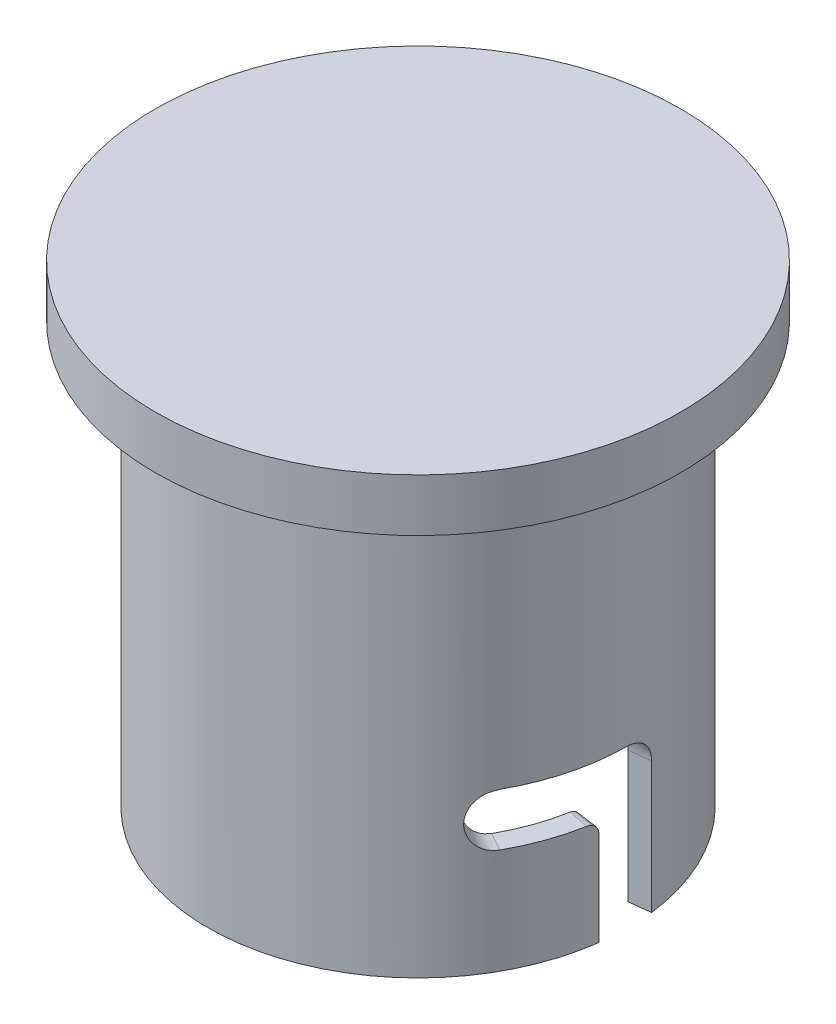
ISO-10303-21;
HEADER;
FILE_DESCRIPTION(('STEP AP214'),'2;1');
FILE_NAME('part.step','',(''),(''),'','','');
FILE_SCHEMA(('AUTOMOTIVE_DESIGN { 1 0 10303 214 1 1 1 1 }'));
ENDSEC;
DATA;
#1=APPLICATION_CONTEXT('core data for automotive mechanical design processes');
#2=APPLICATION_PROTOCOL_DEFINITION('international standard','automotive_design',2000,#1);
#3=PRODUCT_CONTEXT('',#1,'mechanical');
#4=PRODUCT('Part','Part','',(#3));
#5=PRODUCT_RELATED_PRODUCT_CATEGORY('part','',(#4));
#6=PRODUCT_DEFINITION_FORMATION('','',#4);
#7=PRODUCT_DEFINITION_CONTEXT('part definition',#1,'design');
#8=PRODUCT_DEFINITION('design','',#6,#7);
#9=PRODUCT_DEFINITION_SHAPE('','',#8);
#10=(LENGTH_UNIT() NAMED_UNIT(*) SI_UNIT(.MILLI.,.METRE.));
#11=(NAMED_UNIT(*) PLANE_ANGLE_UNIT() SI_UNIT($,.RADIAN.));
#12=(NAMED_UNIT(*) SI_UNIT($,.STERADIAN.) SOLID_ANGLE_UNIT());
#13=UNCERTAINTY_MEASURE_WITH_UNIT(LENGTH_MEASURE(1.E-05),#10,'distance_accuracy_value','');
#14=(GEOMETRIC_REPRESENTATION_CONTEXT(3) GLOBAL_UNCERTAINTY_ASSIGNED_CONTEXT((#13)) GLOBAL_UNIT_ASSIGNED_CONTEXT((#10,
#11,#12)) REPRESENTATION_CONTEXT('',''));
#15=CARTESIAN_POINT('',(0.,0.,0.));
#16=DIRECTION('',(0.,0.,1.));
#17=DIRECTION('',(1.,0.,0.));
#18=AXIS2_PLACEMENT_3D('',#15,#16,#17);
#19=CARTESIAN_POINT('',(0.,40.,0.));
#20=DIRECTION('',(0.,-1.,0.));
#21=DIRECTION('',(0.,0.,-1.));
#22=AXIS2_PLACEMENT_3D('',#19,#20,#21);
#23=CYLINDRICAL_SURFACE('',#22,20.);
#24=CARTESIAN_POINT('',(0.,40.,0.));
#25=DIRECTION('',(0.,1.,0.));
#26=DIRECTION('',(0.,0.,1.));
#27=AXIS2_PLACEMENT_3D('',#24,#25,#26);
#28=CIRCLE('',#27,20.);
#29=CARTESIAN_POINT('',(0.,40.,20.));
#30=VERTEX_POINT('',#29);
#31=EDGE_CURVE('E436',#30,#30,#28,.T.);
#32=ORIENTED_EDGE('',*,*,#31,.F.);
#33=EDGE_LOOP('',(#32));
#34=FACE_BOUND('',#33,.T.);
#35=CARTESIAN_POINT('',(19.8589094074725,12.5,-2.37143778029271));
#36=CARTESIAN_POINT('',(19.8589547040477,12.8308364793802,-2.37105845742376));
#37=CARTESIAN_POINT('',(19.8668685881039,13.153453684531,-2.3072297599529));
#38=CARTESIAN_POINT('',(19.8942803443769,13.7599634714098,-2.05751943892231));
#39=CARTESIAN_POINT('',(19.9133382604535,14.0356629825237,-1.87425378914839));
#40=CARTESIAN_POINT('',(19.9514701062574,14.4998709159118,-1.41163328825012));
#41=CARTESIAN_POINT('',(19.9698885128278,14.6831063583117,-1.13883562178624));
#42=CARTESIAN_POINT('',(19.9953605168616,14.936291301485,-0.528158677817419));
#43=CARTESIAN_POINT('',(20.0016645245603,14.9997250202019,-0.209231886669876));
#44=CARTESIAN_POINT('',(19.9996219608105,15.,0.122969202112117));
#45=B_SPLINE_CURVE_WITH_KNOTS('',3,(#35,#36,#37,#38,#39,#40,#41,#42,#43,#44),.UNSPECIFIED.,.F.,
.F.,(4,2,2,2,4),(0.,0.25,0.5,0.75,1.),.UNSPECIFIED.);
#46=CARTESIAN_POINT('',(19.8589094074725,12.5,-2.37143778029269));
#47=VERTEX_POINT('',#46);
#48=CARTESIAN_POINT('',(19.9996219608105,15.,0.122969202112117));
#49=VERTEX_POINT('',#48);
#50=EDGE_CURVE('E228',#47,#49,#45,.T.);
#51=ORIENTED_EDGE('',*,*,#50,.F.);
#52=DIRECTION('',(0.,1.,0.));
#53=VECTOR('',#52,1.);
#54=CARTESIAN_POINT('',(19.8589094074725,0.,-2.37143778029269));
#55=LINE('',#54,#53);
#56=CARTESIAN_POINT('',(19.8589094074725,0.,-2.3714377802927));
#57=VERTEX_POINT('',#56);
#58=EDGE_CURVE('E222',#57,#47,#55,.T.);
#59=ORIENTED_EDGE('',*,*,#58,.F.);
#60=CARTESIAN_POINT('',(0.,0.,0.));
#61=DIRECTION('',(0.,1.,0.));
#62=DIRECTION('',(0.,0.,1.));
#63=AXIS2_PLACEMENT_3D('',#60,#61,#62);
#64=CIRCLE('',#63,20.);
#65=CARTESIAN_POINT('',(19.8282471024967,0.,2.61545729124608));
#66=VERTEX_POINT('',#65);
#67=EDGE_CURVE('E220',#57,#66,#64,.T.);
#68=ORIENTED_EDGE('',*,*,#67,.T.);
#69=DIRECTION('',(0.,-1.,0.));
#70=VECTOR('',#69,1.);
#71=CARTESIAN_POINT('',(19.8282471024967,8.99999999999999,2.61545729124608));
#72=LINE('',#71,#70);
#73=CARTESIAN_POINT('',(19.8282471024967,8.99999999999999,2.61545729124608));
#74=VERTEX_POINT('',#73);
#75=EDGE_CURVE('E194',#74,#66,#72,.T.);
#76=ORIENTED_EDGE('',*,*,#75,.F.);
#77=CARTESIAN_POINT('',(19.6727485741149,10.,3.60318796896047));
#78=CARTESIAN_POINT('',(19.7205673300936,9.999233775285,3.34210629029147));
#79=CARTESIAN_POINT('',(19.7605805048956,9.89458663830739,3.09105383929096));
#80=CARTESIAN_POINT('',(19.815059057951,9.51962691803397,2.72003497362964));
#81=CARTESIAN_POINT('',(19.8282306451258,9.26463589901939,2.61558205750306));
#82=CARTESIAN_POINT('',(19.8282471024967,9.,2.61545729124608));
#83=B_SPLINE_CURVE_WITH_KNOTS('',3,(#77,#78,#79,#80,#81,#82),.UNSPECIFIED.,.F.,.F.,(4,2,4),(0.,
0.5,1.),.UNSPECIFIED.);
#84=CARTESIAN_POINT('',(19.6727485741149,10.,3.60318796896043));
#85=VERTEX_POINT('',#84);
#86=EDGE_CURVE('E204',#85,#74,#83,.T.);
#87=ORIENTED_EDGE('',*,*,#86,.F.);
#88=CARTESIAN_POINT('',(0.,10.,0.));
#89=DIRECTION('',(0.,-1.,0.));
#90=DIRECTION('',(0.874618245062634,0.,0.484812257893257));
#91=AXIS2_PLACEMENT_3D('',#88,#89,#90);
#92=CIRCLE('',#91,20.);
#93=CARTESIAN_POINT('',(17.4923649012527,10.,9.69624515786516));
#94=VERTEX_POINT('',#93);
#95=EDGE_CURVE('E200',#85,#94,#92,.T.);
#96=ORIENTED_EDGE('',*,*,#95,.T.);
#97=CARTESIAN_POINT('',(17.4923649012527,15.,9.69624515786516));
#98=CARTESIAN_POINT('',(17.4659026222705,14.9935666417804,9.74398403333079));
#99=CARTESIAN_POINT('',(17.4425764725378,14.9878406187517,9.78561162600905));
#100=CARTESIAN_POINT('',(17.412485215332,14.9803125547096,9.83899262372414));
#101=CARTESIAN_POINT('',(17.4032705361512,14.9779800302394,9.85527591818541));
#102=CARTESIAN_POINT('',(17.3906910485126,14.9747464888497,9.87744587682938));
#103=CARTESIAN_POINT('',(17.3867049377865,14.9737128492724,9.88446001329253));
#104=CARTESIAN_POINT('',(17.3791495345321,14.9717339852231,9.89773811556978));
#105=CARTESIAN_POINT('',(17.3778243673571,14.9713906037298,9.90006808876281));
#106=CARTESIAN_POINT('',(17.3498053809616,14.963876304239,9.94918588228946));
#107=CARTESIAN_POINT('',(17.328439976691,14.9577713536587,9.98633092393268));
#108=CARTESIAN_POINT('',(17.2980270682451,14.9484736613065,10.0388579471611));
#109=CARTESIAN_POINT('',(17.2881618909834,14.9453510527756,10.05583516671));
#110=CARTESIAN_POINT('',(17.2689856580186,14.9390590802197,10.0887311794913));
#111=CARTESIAN_POINT('',(17.2619243417968,14.9366851855727,10.1008150620805));
#112=CARTESIAN_POINT('',(17.2055272200847,14.9167441298247,10.1969497146574));
#113=CARTESIAN_POINT('',(17.1626757250958,14.8984401132341,10.2688205072563));
#114=CARTESIAN_POINT('',(17.1020693387832,14.8674573303595,10.3692214025553));
#115=CARTESIAN_POINT('',(17.0824786135493,14.85654194307,10.4014540076984));
#116=CARTESIAN_POINT('',(17.0445604228512,14.8335355824946,10.4634736607118));
#117=CARTESIAN_POINT('',(17.028040366725,14.8227409547647,10.4903390303177));
#118=CARTESIAN_POINT('',(16.9695865812886,14.7808156192456,10.5848296191978));
#119=CARTESIAN_POINT('',(16.9308068870763,14.7480697108806,10.6467349642828));
#120=CARTESIAN_POINT('',(16.8536882697519,14.672986524779,10.7683972323265));
#121=CARTESIAN_POINT('',(16.8138032272806,14.6287360036733,10.8305368153295));
#122=CARTESIAN_POINT('',(16.7041751965448,14.4930768465146,10.9994798831041));
#123=CARTESIAN_POINT('',(16.6329530521104,14.3854551131481,11.1066801565973));
#124=CARTESIAN_POINT('',(16.4379127879278,14.0325267498291,11.3951265247528));
#125=CARTESIAN_POINT('',(16.3312770907187,13.756958011426,11.5457806192111));
#126=CARTESIAN_POINT('',(16.1855131110695,13.1545869989615,11.749247927088));
#127=CARTESIAN_POINT('',(16.1470576085394,12.8263582796933,11.8013783343635));
#128=CARTESIAN_POINT('',(16.1469804649446,12.1718528857845,11.8014838841974));
#129=CARTESIAN_POINT('',(16.1861256874978,11.843076520336,11.7484014228928));
#130=CARTESIAN_POINT('',(16.3315985182214,11.2408319441748,11.5453233217843));
#131=CARTESIAN_POINT('',(16.4371318527038,10.9682975356471,11.3963106729608));
#132=CARTESIAN_POINT('',(16.700312726726,10.4959011473358,11.0070320853245));
#133=CARTESIAN_POINT('',(16.8507940608972,10.3070616306133,10.7769173509493));
#134=CARTESIAN_POINT('',(17.0493647372515,10.155975679482,10.4558530288381));
#135=CARTESIAN_POINT('',(17.0922485936947,10.1289226138573,10.3855841535286));
#136=CARTESIAN_POINT('',(17.1487209377701,10.0996008596797,10.291875448535));
#137=CARTESIAN_POINT('',(17.1682666056992,10.0904538660404,10.2592489787698));
#138=CARTESIAN_POINT('',(17.198632531122,10.0776737622114,10.2082041036913));
#139=CARTESIAN_POINT('',(17.208929045017,10.0735704587067,10.1908382699703));
#140=CARTESIAN_POINT('',(17.2298649480291,10.0656773139072,10.1554013900879));
#141=CARTESIAN_POINT('',(17.2423122648774,10.0612797148598,10.1342480810072));
#142=CARTESIAN_POINT('',(17.2693112707112,10.0522036575486,10.0882185673705));
#143=CARTESIAN_POINT('',(17.2884390896907,10.0463844861088,10.0554215557567));
#144=CARTESIAN_POINT('',(17.3187701219821,10.0380030291007,10.0030299743338));
#145=CARTESIAN_POINT('',(17.3291536103974,10.0352670934566,9.98503340212062));
#146=CARTESIAN_POINT('',(17.3451312207,10.0312500150284,9.95723541753683));
#147=CARTESIAN_POINT('',(17.3505241491294,10.0299254597253,9.9478355662533));
#148=CARTESIAN_POINT('',(17.3614428438929,10.0273052907984,9.92876745024161));
#149=CARTESIAN_POINT('',(17.3692101861179,10.0254960824757,9.91516934926903));
#150=CARTESIAN_POINT('',(17.3993597486922,10.0185881497084,9.86231240866186));
#151=CARTESIAN_POINT('',(17.4395870837337,10.0103453658396,9.79145818390802));
#152=CARTESIAN_POINT('',(17.4923649012527,10.,9.69624515786516));
#153=B_SPLINE_CURVE_WITH_KNOTS('',3,(#97,#98,#99,#100,#101,#102,#103,#104,#105,#106,#107,#108,
#109,#110,#111,#112,#113,#114,#115,#116,#117,#118,#119,#120,#121,#122,#123,#124,#125,#126,#127,
#128,#129,#130,#131,#132,#133,#134,#135,#136,#137,#138,#139,#140,#141,#142,#143,#144,#145,#146,
#147,#148,#149,#150,#151,#152),.UNSPECIFIED.,.F.,.F.,(4,2,2,2,2,2,2,2,2,2,2,2,2,2,2,2,2,2,2,2,2,
2,2,2,2,2,2,4),(0.,0.015625,0.0234375,0.02734375,0.03125,0.046875,0.0546875,0.0625,0.09375,
0.109375,0.125,0.15625,0.1875,0.25,0.375,0.5,0.625,0.75,0.875,0.90625,0.921875,0.9296875,0.9375,
0.953125,0.9609375,0.96484375,0.96875,1.),.UNSPECIFIED.);
#154=CARTESIAN_POINT('',(17.4923649012527,15.,9.69624515786514));
#155=VERTEX_POINT('',#154);
#156=EDGE_CURVE('E235',#155,#94,#153,.T.);
#157=ORIENTED_EDGE('',*,*,#156,.F.);
#158=CARTESIAN_POINT('',(0.,15.,0.));
#159=DIRECTION('',(0.,-1.,0.));
#160=DIRECTION('',(0.874618245062634,0.,0.484812257893257));
#161=AXIS2_PLACEMENT_3D('',#158,#159,#160);
#162=CIRCLE('',#161,20.);
#163=EDGE_CURVE('E241',#49,#155,#162,.T.);
#164=ORIENTED_EDGE('',*,*,#163,.F.);
#165=EDGE_LOOP('',(#51,#59,#68,#76,#87,#96,#157,#164));
#166=FACE_BOUND('',#165,.T.);
#167=ADVANCED_FACE('F124',(#34,#166),#23,.T.);
#168=CARTESIAN_POINT('',(0.,0.,0.));
#169=DIRECTION('',(0.,1.,0.));
#170=DIRECTION('',(0.,0.,1.));
#171=AXIS2_PLACEMENT_3D('',#168,#169,#170);
#172=PLANE('',#171);
#173=ORIENTED_EDGE('',*,*,#67,.F.);
#174=DIRECTION('',(0.992945470373626,0.,-0.118571889014635));
#175=VECTOR('',#174,1.);
#176=CARTESIAN_POINT('',(19.8589094074725,0.,-2.3714377802927));
#177=LINE('',#176,#175);
#178=CARTESIAN_POINT('',(17.8730184667253,0.,-2.13429400226343));
#179=VERTEX_POINT('',#178);
#180=EDGE_CURVE('E414',#179,#57,#177,.T.);
#181=ORIENTED_EDGE('',*,*,#180,.F.);
#182=CARTESIAN_POINT('',(0.,0.,0.));
#183=DIRECTION('',(0.,1.,0.));
#184=DIRECTION('',(0.,0.,1.));
#185=AXIS2_PLACEMENT_3D('',#182,#183,#184);
#186=CIRCLE('',#185,18.);
#187=CARTESIAN_POINT('',(17.845422392247,0.,2.35391156212147));
#188=VERTEX_POINT('',#187);
#189=EDGE_CURVE('E424',#179,#188,#186,.T.);
#190=ORIENTED_EDGE('',*,*,#189,.T.);
#191=DIRECTION('',(0.991412355124834,0.,0.130772864562304));
#192=VECTOR('',#191,1.);
#193=CARTESIAN_POINT('',(19.8282471024967,0.,2.61545729124608));
#194=LINE('',#193,#192);
#195=EDGE_CURVE('E142',#188,#66,#194,.T.);
#196=ORIENTED_EDGE('',*,*,#195,.T.);
#197=EDGE_LOOP('',(#173,#181,#190,#196));
#198=FACE_BOUND('',#197,.T.);
#199=ADVANCED_FACE('F503',(#198),#172,.F.);
#200=CARTESIAN_POINT('',(0.,45.,0.));
#201=DIRECTION('',(0.,-1.,0.));
#202=DIRECTION('',(0.,0.,-1.));
#203=AXIS2_PLACEMENT_3D('',#200,#201,#202);
#204=CYLINDRICAL_SURFACE('',#203,25.);
#205=CARTESIAN_POINT('',(0.,45.,0.));
#206=DIRECTION('',(0.,1.,0.));
#207=DIRECTION('',(0.,0.,1.));
#208=AXIS2_PLACEMENT_3D('',#205,#206,#207);
#209=CIRCLE('',#208,25.);
#210=CARTESIAN_POINT('',(0.,45.,25.));
#211=VERTEX_POINT('',#210);
#212=EDGE_CURVE('E430',#211,#211,#209,.T.);
#213=ORIENTED_EDGE('',*,*,#212,.F.);
#214=EDGE_LOOP('',(#213));
#215=FACE_BOUND('',#214,.T.);
#216=CARTESIAN_POINT('',(0.,40.,0.));
#217=DIRECTION('',(0.,1.,0.));
#218=DIRECTION('',(0.,0.,1.));
#219=AXIS2_PLACEMENT_3D('',#216,#217,#218);
#220=CIRCLE('',#219,25.);
#221=CARTESIAN_POINT('',(0.,40.,25.));
#222=VERTEX_POINT('',#221);
#223=EDGE_CURVE('E433',#222,#222,#220,.T.);
#224=ORIENTED_EDGE('',*,*,#223,.T.);
#225=EDGE_LOOP('',(#224));
#226=FACE_BOUND('',#225,.T.);
#227=ADVANCED_FACE('F508',(#215,#226),#204,.T.);
#228=CARTESIAN_POINT('',(0.,45.,0.));
#229=DIRECTION('',(0.,1.,0.));
#230=DIRECTION('',(0.,0.,1.));
#231=AXIS2_PLACEMENT_3D('',#228,#229,#230);
#232=PLANE('',#231);
#233=ORIENTED_EDGE('',*,*,#212,.T.);
#234=EDGE_LOOP('',(#233));
#235=FACE_BOUND('',#234,.T.);
#236=ADVANCED_FACE('F514',(#235),#232,.T.);
#237=CARTESIAN_POINT('',(0.,40.,0.));
#238=DIRECTION('',(0.,1.,0.));
#239=DIRECTION('',(0.,0.,1.));
#240=AXIS2_PLACEMENT_3D('',#237,#238,#239);
#241=PLANE('',#240);
#242=ORIENTED_EDGE('',*,*,#31,.T.);
#243=EDGE_LOOP('',(#242));
#244=FACE_BOUND('',#243,.T.);
#245=ORIENTED_EDGE('',*,*,#223,.F.);
#246=EDGE_LOOP('',(#245));
#247=FACE_BOUND('',#246,.T.);
#248=ADVANCED_FACE('F511',(#244,#247),#241,.F.);
#249=CARTESIAN_POINT('',(0.,40.,0.));
#250=DIRECTION('',(0.,-1.,0.));
#251=DIRECTION('',(0.,0.,-1.));
#252=AXIS2_PLACEMENT_3D('',#249,#250,#251);
#253=CYLINDRICAL_SURFACE('',#252,18.);
#254=DIRECTION('',(0.,-1.,0.));
#255=VECTOR('',#254,1.);
#256=CARTESIAN_POINT('',(17.8730184667253,40.,-2.13429400226343));
#257=LINE('',#256,#255);
#258=CARTESIAN_POINT('',(17.8730184667253,12.5,-2.13429400226343));
#259=VERTEX_POINT('',#258);
#260=EDGE_CURVE('E98',#259,#179,#257,.T.);
#261=ORIENTED_EDGE('',*,*,#260,.F.);
#262=CARTESIAN_POINT('',(17.9996597647294,15.,0.110672281900905));
#263=CARTESIAN_POINT('',(18.0000183681805,14.9999715038201,0.0528302615950338));
#264=CARTESIAN_POINT('',(18.0000923905676,14.9975306223466,-0.00502097003931292));
#265=CARTESIAN_POINT('',(17.9996895136451,14.9877736966905,-0.120290114524648));
#266=CARTESIAN_POINT('',(17.9992127803985,14.9804591222964,-0.177708152738345));
#267=CARTESIAN_POINT('',(17.9977292689165,14.9609366001135,-0.291507236592393));
#268=CARTESIAN_POINT('',(17.9967242380058,14.9487448150928,-0.3478910703576));
#269=CARTESIAN_POINT('',(17.9942229502004,14.9195966749715,-0.459401007314599));
#270=CARTESIAN_POINT('',(17.9927266783966,14.9026401752636,-0.514527072278656));
#271=CARTESIAN_POINT('',(17.9892931387922,14.8642313739118,-0.62312396124298));
#272=CARTESIAN_POINT('',(17.9873561963751,14.8427823903633,-0.676595973638972));
#273=CARTESIAN_POINT('',(17.9830970027641,14.7957154766263,-0.781655257539518));
#274=CARTESIAN_POINT('',(17.9807747391382,14.7700974119285,-0.833242468167917));
#275=CARTESIAN_POINT('',(17.9758110962034,14.714807094976,-0.934223250709326));
#276=CARTESIAN_POINT('',(17.9731695339072,14.6851325166821,-0.983615542347904));
#277=CARTESIAN_POINT('',(17.9676422921936,14.6220032979068,-1.07988761542142));
#278=CARTESIAN_POINT('',(17.9647566196362,14.5885487636415,-1.12676746740085));
#279=CARTESIAN_POINT('',(17.955526637531,14.4791175142919,-1.26818335940695));
#280=CARTESIAN_POINT('',(17.9488873874375,14.3970389384957,-1.35807333224691));
#281=CARTESIAN_POINT('',(17.9355434854921,14.2202022405086,-1.52422105575738));
#282=CARTESIAN_POINT('',(17.9288388155678,14.1254405170374,-1.60047492014293));
#283=CARTESIAN_POINT('',(17.9154084514108,13.9165686696854,-1.74466788726019));
#284=CARTESIAN_POINT('',(17.9087376295608,13.8014804645141,-1.8111955451498));
#285=CARTESIAN_POINT('',(17.896752671737,13.5623844363101,-1.92603127597794));
#286=CARTESIAN_POINT('',(17.8914395908661,13.4383697718439,-1.97432519327713));
#287=CARTESIAN_POINT('',(17.8847845688621,13.2459197561317,-2.03343918580491));
#288=CARTESIAN_POINT('',(17.8827632347076,13.1795256533206,-2.05109913187368));
#289=CARTESIAN_POINT('',(17.8792660498363,13.0455612654275,-2.08136520032634));
#290=CARTESIAN_POINT('',(17.877790240536,12.9779908914501,-2.09397093899881));
#291=CARTESIAN_POINT('',(17.8754212686871,12.8421972319791,-2.1141006814734));
#292=CARTESIAN_POINT('',(17.8745272402061,12.7739750709107,-2.12163223836604));
#293=CARTESIAN_POINT('',(17.8733285065902,12.6371678423421,-2.13169699123732));
#294=CARTESIAN_POINT('',(17.8730237075431,12.5685828344206,-2.13423098373688));
#295=CARTESIAN_POINT('',(17.8730184667253,12.5,-2.13429400226344));
#296=B_SPLINE_CURVE_WITH_KNOTS('',3,(#262,#263,#264,#265,#266,#267,#268,#269,#270,#271,#272,
#273,#274,#275,#276,#277,#278,#279,#280,#281,#282,#283,#284,#285,#286,#287,#288,#289,#290,#291,
#292,#293,#294,#295),.UNSPECIFIED.,.F.,.F.,(4,2,2,2,2,2,2,2,2,2,2,2,2,2,2,2,4),(0.,
0.173492367120742,0.346932436785423,0.519802436306417,0.692677682935864,0.865425693389871,
1.03817927841145,1.21103234060177,1.38388054686334,1.7479256635214,2.1120743680961,
2.50974225386323,2.90771823463729,3.11375231324097,3.31980203082797,3.52554435478116,
3.73125388449651),.UNSPECIFIED.);
#297=CARTESIAN_POINT('',(17.9996597647294,15.,0.110672281900905));
#298=VERTEX_POINT('',#297);
#299=EDGE_CURVE('E134',#298,#259,#296,.T.);
#300=ORIENTED_EDGE('',*,*,#299,.F.);
#301=CARTESIAN_POINT('',(0.,15.,0.));
#302=DIRECTION('',(0.,1.,0.));
#303=DIRECTION('',(0.,0.,1.));
#304=AXIS2_PLACEMENT_3D('',#301,#302,#303);
#305=CIRCLE('',#304,18.);
#306=CARTESIAN_POINT('',(15.7431284111274,15.,8.72662064207864));
#307=VERTEX_POINT('',#306);
#308=EDGE_CURVE('E454',#307,#298,#305,.T.);
#309=ORIENTED_EDGE('',*,*,#308,.F.);
#310=CARTESIAN_POINT('',(15.7431284111274,10.,8.72662064207865));
#311=CARTESIAN_POINT('',(15.7317229290969,10.0024878777271,8.74719654810981));
#312=CARTESIAN_POINT('',(15.7202781689798,10.004996715809,8.76774813976662));
#313=CARTESIAN_POINT('',(15.6973123285516,10.0101036343808,8.80879894234515));
#314=CARTESIAN_POINT('',(15.6857912442053,10.01270171962,8.82929815041676));
#315=CARTESIAN_POINT('',(15.6625858740281,10.0180550384178,8.87039823352892));
#316=CARTESIAN_POINT('',(15.6509010164358,10.0208113415318,8.89099865090343));
#317=CARTESIAN_POINT('',(15.6274724945353,10.0266846069423,8.93211416667943));
#318=CARTESIAN_POINT('',(15.6157288320049,10.0298015583987,8.95262926762611));
#319=CARTESIAN_POINT('',(15.5921589872216,10.036430636612,8.99361651985535));
#320=CARTESIAN_POINT('',(15.5803326735826,10.0399437083639,9.0140884444563));
#321=CARTESIAN_POINT('',(15.5566391133484,10.0474606107385,9.05491783535639));
#322=CARTESIAN_POINT('',(15.5447718663474,10.0514644462406,9.07527530051539));
#323=CARTESIAN_POINT('',(15.5093374569825,10.0643423417288,9.13578796077407));
#324=CARTESIAN_POINT('',(15.4857337698074,10.0741356663907,9.1757378216909));
#325=CARTESIAN_POINT('',(15.4504289951437,10.0911452537742,9.23497544983474));
#326=CARTESIAN_POINT('',(15.4386932355627,10.0971920387016,9.2545809075202));
#327=CARTESIAN_POINT('',(15.4211306897434,10.1069195751566,9.28379541256917));
#328=CARTESIAN_POINT('',(15.4152833111664,10.1102716759339,9.29350137581023));
#329=CARTESIAN_POINT('',(15.4036120309525,10.1172373260235,9.312833295255));
#330=CARTESIAN_POINT('',(15.397788129426,10.1208508765623,9.32245925108317));
#331=CARTESIAN_POINT('',(15.3803651409678,10.132021266862,9.3511961540108));
#332=CARTESIAN_POINT('',(15.3687975267638,10.1399174842588,9.37019481506066));
#333=CARTESIAN_POINT('',(15.3457564032314,10.1565466999167,9.40788221331776));
#334=CARTESIAN_POINT('',(15.334282900008,10.1652797520056,9.42657093049764));
#335=CARTESIAN_POINT('',(15.3085079364099,10.1860699799391,9.46838612495715));
#336=CARTESIAN_POINT('',(15.2942473027413,10.1984008847684,9.49140224360571));
#337=CARTESIAN_POINT('',(15.2659440374497,10.2243154810207,9.5368584560005));
#338=CARTESIAN_POINT('',(15.2519014601793,10.2378994791133,9.55929840701433));
#339=CARTESIAN_POINT('',(15.2101138264167,10.2804957614637,9.62575594732735));
#340=CARTESIAN_POINT('',(15.1827415055189,10.3113256828568,9.66885834738344));
#341=CARTESIAN_POINT('',(15.1291896831505,10.3772311293762,9.75243995146735));
#342=CARTESIAN_POINT('',(15.1030100650018,10.412306237977,9.79291941225296));
#343=CARTESIAN_POINT('',(15.0519779988445,10.4861754373805,9.87117718205479));
#344=CARTESIAN_POINT('',(15.0271248534379,10.5249675433622,9.90895691407633));
#345=CARTESIAN_POINT('',(14.9790327021264,10.6054835913849,9.98150584723584));
#346=CARTESIAN_POINT('',(14.9557819658977,10.6471803924283,10.0162975226071));
#347=CARTESIAN_POINT('',(14.9107268996541,10.7333839853407,10.0832459593542));
#348=CARTESIAN_POINT('',(14.8889227729741,10.7778911705275,10.1154023504644));
#349=CARTESIAN_POINT('',(14.8469295069363,10.869530625361,10.176938302796));
#350=CARTESIAN_POINT('',(14.8267407459207,10.9166635056245,10.2063172137819));
#351=CARTESIAN_POINT('',(14.7881401247706,11.0133156393061,10.2621666337033));
#352=CARTESIAN_POINT('',(14.7697282412841,11.0628348613495,10.2886371808617));
#353=CARTESIAN_POINT('',(14.7314636069549,11.1737037180308,10.3433698487364));
#354=CARTESIAN_POINT('',(14.7120102114658,11.2355027984066,10.3710042078261));
#355=CARTESIAN_POINT('',(14.6759710089114,11.361671091432,10.4219407445524));
#356=CARTESIAN_POINT('',(14.6593855185884,11.4260405870027,10.4452424436952));
#357=CARTESIAN_POINT('',(14.6291905705137,11.5568941870491,10.4874905520996));
#358=CARTESIAN_POINT('',(14.6155820695277,11.6233789635082,10.5064355612773));
#359=CARTESIAN_POINT('',(14.5914054220482,11.7579754377425,10.5399865020318));
#360=CARTESIAN_POINT('',(14.5808374660275,11.8260872371522,10.5545921617747));
#361=CARTESIAN_POINT('',(14.5623421078261,11.9666379237802,10.5800969735323));
#362=CARTESIAN_POINT('',(14.5545579553203,12.0391320409016,10.5907955280239));
#363=CARTESIAN_POINT('',(14.5423798578602,12.1849357220092,10.6075112415259));
#364=CARTESIAN_POINT('',(14.5379856927873,12.2582452327367,10.6135287044889));
#365=CARTESIAN_POINT('',(14.5326881977297,12.4052596952946,10.6207812572622));
#366=CARTESIAN_POINT('',(14.5317863583688,12.4789648025391,10.6220143049485));
#367=CARTESIAN_POINT('',(14.533470963444,12.6262656273238,10.6197091848407));
#368=CARTESIAN_POINT('',(14.5360578285659,12.6998613306001,10.6161704416397));
#369=CARTESIAN_POINT('',(14.5448830250271,12.850641416773,10.6040764784093));
#370=CARTESIAN_POINT('',(14.5513202634593,12.9277924127778,10.5952479459495));
#371=CARTESIAN_POINT('',(14.5679680570596,13.0809015428253,10.5723463365024));
#372=CARTESIAN_POINT('',(14.5781785554479,13.1568596947998,10.5582733384334));
#373=CARTESIAN_POINT('',(14.6023634132824,13.3069471807572,10.5247997395257));
#374=CARTESIAN_POINT('',(14.616335794481,13.3810774536583,10.5054019387171));
#375=CARTESIAN_POINT('',(14.6479974728938,13.5268916668146,10.461209576177));
#376=CARTESIAN_POINT('',(14.665686486345,13.5985757933465,10.4364154264492));
#377=CARTESIAN_POINT('',(14.7040047589728,13.737061085666,10.3823558372588));
#378=CARTESIAN_POINT('',(14.7245421218728,13.8039417327277,10.3532286223329));
#379=CARTESIAN_POINT('',(14.7686925669299,13.9343273529258,10.2901506454527));
#380=CARTESIAN_POINT('',(14.7923054779181,13.9978325136474,10.2562001519273));
#381=CARTESIAN_POINT('',(14.842402728831,14.1210692727476,10.183566713348));
#382=CARTESIAN_POINT('',(14.8688926176424,14.1807932141935,10.1448746039183));
#383=CARTESIAN_POINT('',(14.9244436500233,14.2957602336658,10.0629732290746));
#384=CARTESIAN_POINT('',(14.9535037843186,14.3510050543461,10.0197657355447));
#385=CARTESIAN_POINT('',(15.0054289190327,14.4413549068629,9.94176204044031));
#386=CARTESIAN_POINT('',(15.0277162400671,14.4777311891204,9.90805137296592));
#387=CARTESIAN_POINT('',(15.0620156609963,14.5300043578971,9.85576577130177));
#388=CARTESIAN_POINT('',(15.073595042131,14.5470488579518,9.83804831636241));
#389=CARTESIAN_POINT('',(15.0970480595393,14.5802909486062,9.80202028923999));
#390=CARTESIAN_POINT('',(15.1089217024623,14.5964885200418,9.78370970365089));
#391=CARTESIAN_POINT('',(15.1328672881473,14.6278908347886,9.74663076118663));
#392=CARTESIAN_POINT('',(15.1449374639914,14.6431012943876,9.72786610667716));
#393=CARTESIAN_POINT('',(15.1693207539384,14.672625235159,9.68979978546257));
#394=CARTESIAN_POINT('',(15.18163386796,14.686938716631,9.67049811893687));
#395=CARTESIAN_POINT('',(15.2189471887938,14.7282994521294,9.61175289876427));
#396=CARTESIAN_POINT('',(15.2443417271216,14.7537940965546,9.57143765390025));
#397=CARTESIAN_POINT('',(15.2830658961513,14.7885367343677,9.50938974153226));
#398=CARTESIAN_POINT('',(15.2960887804536,14.7995409337034,9.4884292141953));
#399=CARTESIAN_POINT('',(15.3157517092806,14.8151642183598,9.45663285709439));
#400=CARTESIAN_POINT('',(15.322327648151,14.8202249468728,9.44597449129013));
#401=CARTESIAN_POINT('',(15.3355258394785,14.830008802888,9.42453211376836));
#402=CARTESIAN_POINT('',(15.3421480933605,14.8347319199532,9.41374809817847));
#403=CARTESIAN_POINT('',(15.3620614826574,14.8485007177842,9.38124261600023));
#404=CARTESIAN_POINT('',(15.3753947973465,14.8571423792485,9.35937490557119));
#405=CARTESIAN_POINT('',(15.4021326086679,14.8734084539574,9.31530867334006));
#406=CARTESIAN_POINT('',(15.4155371101259,14.881032797299,9.29311012892176));
#407=CARTESIAN_POINT('',(15.4559643826637,14.9026538797221,9.22582852370918));
#408=CARTESIAN_POINT('',(15.4830340004699,14.9152865645932,9.18033177334237));
#409=CARTESIAN_POINT('',(15.5370650906976,14.9375924755308,9.08858862097825));
#410=CARTESIAN_POINT('',(15.5640265710207,14.9472659218649,9.04234227504619));
#411=CARTESIAN_POINT('',(15.6037449109403,14.9603224337063,8.973506129479));
#412=CARTESIAN_POINT('',(15.6166104482075,14.9643642449137,8.95109757452211));
#413=CARTESIAN_POINT('',(15.6422704522276,14.9720796546408,8.90618006941271));
#414=CARTESIAN_POINT('',(15.6550649277421,14.9757532995497,8.88367113228271));
#415=CARTESIAN_POINT('',(15.6804570087569,14.9829010445976,8.83877410005657));
#416=CARTESIAN_POINT('',(15.6930553592109,14.9863765995271,8.81638665098148));
#417=CARTESIAN_POINT('',(15.7181611775371,14.9932372615985,8.77154886407303));
#418=CARTESIAN_POINT('',(15.7306686510885,14.9966223744283,8.74909853029306));
#419=CARTESIAN_POINT('',(15.7431284111281,15.,8.72662064207904));
#420=B_SPLINE_CURVE_WITH_KNOTS('',3,(#310,#311,#312,#313,#314,#315,#316,#317,#318,#319,#320,
#321,#322,#323,#324,#325,#326,#327,#328,#329,#330,#331,#332,#333,#334,#335,#336,#337,#338,#339,
#340,#341,#342,#343,#344,#345,#346,#347,#348,#349,#350,#351,#352,#353,#354,#355,#356,#357,#358,
#359,#360,#361,#362,#363,#364,#365,#366,#367,#368,#369,#370,#371,#372,#373,#374,#375,#376,#377,
#378,#379,#380,#381,#382,#383,#384,#385,#386,#387,#388,#389,#390,#391,#392,#393,#394,#395,#396,
#397,#398,#399,#400,#401,#402,#403,#404,#405,#406,#407,#408,#409,#410,#411,#412,#413,#414,#415,
#416,#417,#418,#419),.UNSPECIFIED.,.F.,.F.,(4,2,2,2,2,2,2,2,2,2,2,2,2,2,2,2,2,2,2,2,2,2,2,2,2,2,
2,2,2,2,2,2,2,2,2,2,2,2,2,2,2,2,2,2,2,2,2,2,2,2,2,2,2,2,4),(0.,0.070970146203612,
0.141944074917147,0.213472736314017,0.284999248303,0.356700157819563,0.428401780295381,
0.570569459975069,0.64146298706418,0.676910304969536,0.712357789167346,0.783148370515895,
0.853943508389766,0.943156356279565,1.03239109545785,1.21106262097284,1.38971662994512,
1.56827576642243,1.74534615494187,1.92244137991058,2.09957796248395,2.27671221678041,
2.48777008811675,2.69885125460545,2.91000016050374,3.12116229081047,3.34200410380426,
3.56283157590031,3.78375329305552,4.00470165246331,4.23818998580549,4.47167480577307,
4.70503708293307,4.93838154946426,5.16544882683588,5.39250347222271,5.62000409233351,
5.84741577166117,6.01039227533888,6.09190089604404,6.17341136030854,6.25439749513751,
6.33538360290876,6.49721751716001,6.57824917102837,6.61876738427779,6.65928684957234,
6.74035317271946,6.82142506331245,6.98458190038815,7.14772659011388,7.22618558399343,
7.30463467950672,7.38240311232029,7.46016664271397),.UNSPECIFIED.);
#421=CARTESIAN_POINT('',(15.7431284111274,10.,8.72662064207865));
#422=VERTEX_POINT('',#421);
#423=EDGE_CURVE('E451',#422,#307,#420,.T.);
#424=ORIENTED_EDGE('',*,*,#423,.F.);
#425=CARTESIAN_POINT('',(0.,10.,0.));
#426=DIRECTION('',(0.,1.,0.));
#427=DIRECTION('',(0.,0.,1.));
#428=AXIS2_PLACEMENT_3D('',#425,#426,#427);
#429=CIRCLE('',#428,18.);
#430=CARTESIAN_POINT('',(17.7054737167034,10.,3.24286917206441));
#431=VERTEX_POINT('',#430);
#432=EDGE_CURVE('E412',#431,#422,#429,.F.);
#433=ORIENTED_EDGE('',*,*,#432,.F.);
#434=CARTESIAN_POINT('',(17.845422392247,9.,2.35391156212147));
#435=CARTESIAN_POINT('',(17.8454129439664,9.05979623054441,2.35392098660808));
#436=CARTESIAN_POINT('',(17.8447832260674,9.11960510788237,2.35875543460277));
#437=CARTESIAN_POINT('',(17.8422376849362,9.2378430326031,2.37796696892373));
#438=CARTESIAN_POINT('',(17.8403175936794,9.29626683264833,2.39237572132818));
#439=CARTESIAN_POINT('',(17.8350598221386,9.41178728432241,2.43125830920071));
#440=CARTESIAN_POINT('',(17.8316774168049,9.46877637357737,2.45604885256962));
#441=CARTESIAN_POINT('',(17.8234084870536,9.57728436524177,2.51535428829476));
#442=CARTESIAN_POINT('',(17.8185238653711,9.62881007726997,2.54985687454082));
#443=CARTESIAN_POINT('',(17.8075494980536,9.72111708621833,2.62536334557046));
#444=CARTESIAN_POINT('',(17.801560772511,9.76238350366511,2.6657866291567));
#445=CARTESIAN_POINT('',(17.7881871426124,9.83644915397606,2.75360847994606));
#446=CARTESIAN_POINT('',(17.7808027504841,9.86925148285613,2.80100448665975));
#447=CARTESIAN_POINT('',(17.7656018466174,9.92164806827076,2.89576215434445));
#448=CARTESIAN_POINT('',(17.7579194498537,9.94229013750967,2.94256807707968));
#449=CARTESIAN_POINT('',(17.7416668487786,9.9744876552079,3.0390180589664));
#450=CARTESIAN_POINT('',(17.7330985383861,9.98606205192404,3.08865596598573));
#451=CARTESIAN_POINT('',(17.721159259056,9.99516793235041,3.15607781285444));
#452=CARTESIAN_POINT('',(17.7180634451906,9.99693118486248,3.17341151577071));
#453=CARTESIAN_POINT('',(17.7118121144595,9.99931740064097,3.2081179116728));
#454=CARTESIAN_POINT('',(17.7086567006039,9.9999421766788,3.22549049849703));
#455=CARTESIAN_POINT('',(17.7054737167034,10.,3.24286917206443));
#456=B_SPLINE_CURVE_WITH_KNOTS('',3,(#434,#435,#436,#437,#438,#439,#440,#441,#442,#443,#444,
#445,#446,#447,#448,#449,#450,#451,#452,#453,#454,#455),.UNSPECIFIED.,.F.,.F.,(4,2,2,2,2,2,2,2,
2,2,4),(0.,0.179218356450062,0.359032430270712,0.544785326517594,0.730303907012371,
0.903557758730256,1.07674814708685,1.23112193200368,1.38517226293528,1.43823293861353,
1.49120905285444),.UNSPECIFIED.);
#457=CARTESIAN_POINT('',(17.845422392247,9.,2.35391156212148));
#458=VERTEX_POINT('',#457);
#459=EDGE_CURVE('E441',#458,#431,#456,.T.);
#460=ORIENTED_EDGE('',*,*,#459,.F.);
#461=DIRECTION('',(0.,-1.,0.));
#462=VECTOR('',#461,1.);
#463=CARTESIAN_POINT('',(17.845422392247,40.,2.35391156212147));
#464=LINE('',#463,#462);
#465=EDGE_CURVE('E195',#188,#458,#464,.F.);
#466=ORIENTED_EDGE('',*,*,#465,.F.);
#467=ORIENTED_EDGE('',*,*,#189,.F.);
#468=EDGE_LOOP('',(#261,#300,#309,#424,#433,#460,#466,#467));
#469=FACE_BOUND('',#468,.T.);
#470=CARTESIAN_POINT('',(0.,42.,0.));
#471=DIRECTION('',(0.,1.,0.));
#472=DIRECTION('',(0.,0.,1.));
#473=AXIS2_PLACEMENT_3D('',#470,#471,#472);
#474=CIRCLE('',#473,18.);
#475=CARTESIAN_POINT('',(0.,42.,18.));
#476=VERTEX_POINT('',#475);
#477=EDGE_CURVE('E427',#476,#476,#474,.T.);
#478=ORIENTED_EDGE('',*,*,#477,.T.);
#479=EDGE_LOOP('',(#478));
#480=FACE_BOUND('',#479,.T.);
#481=ADVANCED_FACE('F357',(#469,#480),#253,.F.);
#482=CARTESIAN_POINT('',(0.,45.,0.));
#483=DIRECTION('',(0.,-1.,0.));
#484=DIRECTION('',(0.,0.,-1.));
#485=AXIS2_PLACEMENT_3D('',#482,#483,#484);
#486=CYLINDRICAL_SURFACE('',#485,23.);
#487=CARTESIAN_POINT('',(0.,43.,0.));
#488=DIRECTION('',(0.,1.,0.));
#489=DIRECTION('',(0.,0.,1.));
#490=AXIS2_PLACEMENT_3D('',#487,#488,#489);
#491=CIRCLE('',#490,23.);
#492=CARTESIAN_POINT('',(0.,43.,23.));
#493=VERTEX_POINT('',#492);
#494=EDGE_CURVE('E419',#493,#493,#491,.T.);
#495=ORIENTED_EDGE('',*,*,#494,.T.);
#496=EDGE_LOOP('',(#495));
#497=FACE_BOUND('',#496,.T.);
#498=CARTESIAN_POINT('',(0.,42.,0.));
#499=DIRECTION('',(0.,1.,0.));
#500=DIRECTION('',(0.,0.,1.));
#501=AXIS2_PLACEMENT_3D('',#498,#499,#500);
#502=CIRCLE('',#501,23.);
#503=CARTESIAN_POINT('',(0.,42.,23.));
#504=VERTEX_POINT('',#503);
#505=EDGE_CURVE('E415',#504,#504,#502,.T.);
#506=ORIENTED_EDGE('',*,*,#505,.F.);
#507=EDGE_LOOP('',(#506));
#508=FACE_BOUND('',#507,.T.);
#509=ADVANCED_FACE('F533',(#497,#508),#486,.F.);
#510=CARTESIAN_POINT('',(0.,43.,0.));
#511=DIRECTION('',(0.,1.,0.));
#512=DIRECTION('',(0.,0.,1.));
#513=AXIS2_PLACEMENT_3D('',#510,#511,#512);
#514=PLANE('',#513);
#515=ORIENTED_EDGE('',*,*,#494,.F.);
#516=EDGE_LOOP('',(#515));
#517=FACE_BOUND('',#516,.T.);
#518=ADVANCED_FACE('F530',(#517),#514,.F.);
#519=CARTESIAN_POINT('',(0.,42.,0.));
#520=DIRECTION('',(0.,1.,0.));
#521=DIRECTION('',(0.,0.,1.));
#522=AXIS2_PLACEMENT_3D('',#519,#520,#521);
#523=PLANE('',#522);
#524=ORIENTED_EDGE('',*,*,#477,.F.);
#525=EDGE_LOOP('',(#524));
#526=FACE_BOUND('',#525,.T.);
#527=ORIENTED_EDGE('',*,*,#505,.T.);
#528=EDGE_LOOP('',(#527));
#529=FACE_BOUND('',#528,.T.);
#530=ADVANCED_FACE('F350',(#526,#529),#523,.T.);
#531=CARTESIAN_POINT('',(19.8589094074725,6.25,-2.37143778029269));
#532=DIRECTION('',(-0.118571889014635,0.,-0.992945470373626));
#533=DIRECTION('',(0.,1.,0.));
#534=AXIS2_PLACEMENT_3D('',#531,#532,#533);
#535=PLANE('',#534);
#536=ORIENTED_EDGE('',*,*,#260,.T.);
#537=ORIENTED_EDGE('',*,*,#180,.T.);
#538=ORIENTED_EDGE('',*,*,#58,.T.);
#539=CARTESIAN_POINT('',(14.8941820556044,12.5,-1.77857833521953));
#540=CARTESIAN_POINT('',(19.8589094074725,12.5,-2.37143778029271));
#541=B_SPLINE_CURVE_WITH_KNOTS('',1,(#539,#540),.UNSPECIFIED.,.F.,.F.,(2,2),(0.,1.),.UNSPECIFIED.);
#542=EDGE_CURVE('E413',#259,#47,#541,.T.);
#543=ORIENTED_EDGE('',*,*,#542,.F.);
#544=EDGE_LOOP('',(#536,#537,#538,#543));
#545=FACE_BOUND('',#544,.T.);
#546=ADVANCED_FACE('F340',(#545),#535,.F.);
#547=CARTESIAN_POINT('',(19.8589094074725,12.5,-2.37143778029271));
#548=CARTESIAN_POINT('',(19.8589547040477,12.8308364793802,-2.37105845742376));
#549=CARTESIAN_POINT('',(19.8668685881039,13.153453684531,-2.3072297599529));
#550=CARTESIAN_POINT('',(19.8942803443769,13.7599634714098,-2.05751943892231));
#551=CARTESIAN_POINT('',(19.9133382604535,14.0356629825237,-1.87425378914839));
#552=CARTESIAN_POINT('',(19.9514701062574,14.4998709159118,-1.41163328825012));
#553=CARTESIAN_POINT('',(19.9698885128278,14.6831063583117,-1.13883562178624));
#554=CARTESIAN_POINT('',(19.9953605168616,14.936291301485,-0.528158677817419));
#555=CARTESIAN_POINT('',(20.0016645245603,14.9997250202019,-0.209231886669876));
#556=CARTESIAN_POINT('',(19.9996219608105,15.,0.122969202112117));
#557=CARTESIAN_POINT('',(14.8941820556044,12.5,-1.77857833521953));
#558=CARTESIAN_POINT('',(14.89421602807,12.8308368124587,-1.7782938427814));
#559=CARTESIAN_POINT('',(14.9001514410779,13.153453684531,-1.73042231996467));
#560=CARTESIAN_POINT('',(14.9207102582826,13.7599634714098,-1.54313957919173));
#561=CARTESIAN_POINT('',(14.9350036953401,14.0356629825237,-1.4056903418613));
#562=CARTESIAN_POINT('',(14.9636025796931,14.4998709159118,-1.05872496618759));
#563=CARTESIAN_POINT('',(14.9774163846209,14.6831063583117,-0.854126716339677));
#564=CARTESIAN_POINT('',(14.9965203876462,14.936291301485,-0.396119008363064));
#565=CARTESIAN_POINT('',(15.0012483934202,14.9997250202019,-0.156923915000161));
#566=CARTESIAN_POINT('',(14.9997164706078,15.,0.0922269015840878));
#567=B_SPLINE_SURFACE_WITH_KNOTS('',1,3,((#547,#548,#549,#550,#551,#552,#553,#554,#555,#556),
(#557,#558,#559,#560,#561,#562,#563,#564,#565,#566)),.UNSPECIFIED.,.F.,.F.,.F.,(2,2),(4,2,2,2,
4),(0.,1.),(0.,0.25,0.5,0.75,1.),.UNSPECIFIED.);
#568=CARTESIAN_POINT('',(19.9996219608105,15.,0.122969202112117));
#569=CARTESIAN_POINT('',(14.9997164706078,15.,0.0922269015840878));
#570=B_SPLINE_CURVE_WITH_KNOTS('',1,(#568,#569),.UNSPECIFIED.,.F.,.F.,(2,2),(0.,1.),.UNSPECIFIED.);
#571=EDGE_CURVE('E321',#298,#49,#570,.F.);
#572=ORIENTED_EDGE('',*,*,#299,.T.);
#573=ORIENTED_EDGE('',*,*,#542,.T.);
#574=ORIENTED_EDGE('',*,*,#50,.T.);
#575=ORIENTED_EDGE('',*,*,#571,.F.);
#576=EDGE_LOOP('',(#572,#573,#574,#575));
#577=FACE_BOUND('',#576,.T.);
#578=ADVANCED_FACE('F349',(#577),#567,.F.);
#579=CARTESIAN_POINT('',(0.,15.,0.));
#580=DIRECTION('',(0.,1.,0.));
#581=DIRECTION('',(0.,0.,1.));
#582=AXIS2_PLACEMENT_3D('',#579,#580,#581);
#583=PLANE('',#582);
#584=ORIENTED_EDGE('',*,*,#308,.T.);
#585=ORIENTED_EDGE('',*,*,#571,.T.);
#586=ORIENTED_EDGE('',*,*,#163,.T.);
#587=CARTESIAN_POINT('',(13.1192736759395,15.,7.27218386839887));
#588=CARTESIAN_POINT('',(17.4923649012527,15.,9.69624515786516));
#589=B_SPLINE_CURVE_WITH_KNOTS('',1,(#587,#588),.UNSPECIFIED.,.F.,.F.,(2,2),(0.,1.),.UNSPECIFIED.);
#590=EDGE_CURVE('E316',#307,#155,#589,.T.);
#591=ORIENTED_EDGE('',*,*,#590,.F.);
#592=EDGE_LOOP('',(#584,#585,#586,#591));
#593=FACE_BOUND('',#592,.T.);
#594=ADVANCED_FACE('F280',(#593),#583,.F.);
#595=CARTESIAN_POINT('',(17.4923649012527,15.,9.69624515786516));
#596=CARTESIAN_POINT('',(17.4659026222705,14.9935666417804,9.74398403333079));
#597=CARTESIAN_POINT('',(17.4425764725378,14.9878406187517,9.78561162600905));
#598=CARTESIAN_POINT('',(17.412485215332,14.9803125547096,9.83899262372414));
#599=CARTESIAN_POINT('',(17.4032705361512,14.9779800302394,9.85527591818541));
#600=CARTESIAN_POINT('',(17.3906910485126,14.9747464888497,9.87744587682938));
#601=CARTESIAN_POINT('',(17.3867049377865,14.9737128492724,9.88446001329253));
#602=CARTESIAN_POINT('',(17.3791495345321,14.9717339852231,9.89773811556978));
#603=CARTESIAN_POINT('',(17.3778243673571,14.9713906037298,9.90006808876281));
#604=CARTESIAN_POINT('',(17.3498053809616,14.963876304239,9.94918588228946));
#605=CARTESIAN_POINT('',(17.328439976691,14.9577713536587,9.98633092393268));
#606=CARTESIAN_POINT('',(17.2980270682451,14.9484736613065,10.0388579471611));
#607=CARTESIAN_POINT('',(17.2881618909834,14.9453510527756,10.05583516671));
#608=CARTESIAN_POINT('',(17.2689856580186,14.9390590802197,10.0887311794913));
#609=CARTESIAN_POINT('',(17.2619243417968,14.9366851855727,10.1008150620805));
#610=CARTESIAN_POINT('',(17.2055272200847,14.9167441298247,10.1969497146574));
#611=CARTESIAN_POINT('',(17.1626757250958,14.8984401132341,10.2688205072563));
#612=CARTESIAN_POINT('',(17.1020693387832,14.8674573303595,10.3692214025553));
#613=CARTESIAN_POINT('',(17.0824786135493,14.85654194307,10.4014540076984));
#614=CARTESIAN_POINT('',(17.0445604228512,14.8335355824946,10.4634736607118));
#615=CARTESIAN_POINT('',(17.028040366725,14.8227409547647,10.4903390303177));
#616=CARTESIAN_POINT('',(16.9695865812886,14.7808156192456,10.5848296191978));
#617=CARTESIAN_POINT('',(16.9308068870763,14.7480697108806,10.6467349642828));
#618=CARTESIAN_POINT('',(16.8536882697519,14.672986524779,10.7683972323265));
#619=CARTESIAN_POINT('',(16.8138032272806,14.6287360036733,10.8305368153295));
#620=CARTESIAN_POINT('',(16.7041751965448,14.4930768465146,10.9994798831041));
#621=CARTESIAN_POINT('',(16.6329530521104,14.3854551131481,11.1066801565973));
#622=CARTESIAN_POINT('',(16.4379127879278,14.0325267498291,11.3951265247528));
#623=CARTESIAN_POINT('',(16.3312770907187,13.756958011426,11.5457806192111));
#624=CARTESIAN_POINT('',(16.1855131110695,13.1545869989615,11.749247927088));
#625=CARTESIAN_POINT('',(16.1470576085394,12.8263582796933,11.8013783343635));
#626=CARTESIAN_POINT('',(16.1469804649446,12.1718528857845,11.8014838841974));
#627=CARTESIAN_POINT('',(16.1861256874978,11.843076520336,11.7484014228928));
#628=CARTESIAN_POINT('',(16.3315985182214,11.2408319441748,11.5453233217843));
#629=CARTESIAN_POINT('',(16.4371318527038,10.9682975356471,11.3963106729608));
#630=CARTESIAN_POINT('',(16.700312726726,10.4959011473358,11.0070320853245));
#631=CARTESIAN_POINT('',(16.8507940608972,10.3070616306133,10.7769173509493));
#632=CARTESIAN_POINT('',(17.0493647372515,10.155975679482,10.4558530288381));
#633=CARTESIAN_POINT('',(17.0922485936947,10.1289226138573,10.3855841535286));
#634=CARTESIAN_POINT('',(17.1487209377701,10.0996008596797,10.291875448535));
#635=CARTESIAN_POINT('',(17.1682666056992,10.0904538660404,10.2592489787698));
#636=CARTESIAN_POINT('',(17.198632531122,10.0776737622114,10.2082041036913));
#637=CARTESIAN_POINT('',(17.208929045017,10.0735704587067,10.1908382699703));
#638=CARTESIAN_POINT('',(17.2298649480291,10.0656773139072,10.1554013900879));
#639=CARTESIAN_POINT('',(17.2423122648774,10.0612797148598,10.1342480810072));
#640=CARTESIAN_POINT('',(17.2693112707112,10.0522036575486,10.0882185673705));
#641=CARTESIAN_POINT('',(17.2884390896907,10.0463844861088,10.0554215557567));
#642=CARTESIAN_POINT('',(17.3187701219821,10.0380030291007,10.0030299743338));
#643=CARTESIAN_POINT('',(17.3291536103974,10.0352670934566,9.98503340212062));
#644=CARTESIAN_POINT('',(17.3451312207,10.0312500150284,9.95723541753683));
#645=CARTESIAN_POINT('',(17.3505241491294,10.0299254597253,9.9478355662533));
#646=CARTESIAN_POINT('',(17.3614428438929,10.0273052907984,9.92876745024161));
#647=CARTESIAN_POINT('',(17.3692101861179,10.0254960824757,9.91516934926903));
#648=CARTESIAN_POINT('',(17.3993597486922,10.0185881497084,9.86231240866186));
#649=CARTESIAN_POINT('',(17.4395870837337,10.0103453658396,9.79145818390802));
#650=CARTESIAN_POINT('',(17.4923649012527,10.,9.69624515786516));
#651=CARTESIAN_POINT('',(13.1192736759395,15.,7.27218386839887));
#652=CARTESIAN_POINT('',(13.0994269669362,14.993566641856,7.30798802457705));
#653=CARTESIAN_POINT('',(13.0819323544033,14.9878406187517,7.33920871950679));
#654=CARTESIAN_POINT('',(13.059363911499,14.9803125547096,7.3792444677931));
#655=CARTESIAN_POINT('',(13.0524529021134,14.9779800302394,7.39145693863906));
#656=CARTESIAN_POINT('',(13.0430182863844,14.9747464888497,7.40808440762204));
#657=CARTESIAN_POINT('',(13.0400287033399,14.9737128492724,7.4133450099694));
#658=CARTESIAN_POINT('',(13.0343621508991,14.9717339852231,7.42330358667734));
#659=CARTESIAN_POINT('',(13.0333682755178,14.9713906037298,7.42505106657211));
#660=CARTESIAN_POINT('',(13.0123540357212,14.963876304239,7.46188941171709));
#661=CARTESIAN_POINT('',(12.9963299825182,14.9577713536587,7.48974819294951));
#662=CARTESIAN_POINT('',(12.9735203011838,14.9484736613065,7.5291434603708));
#663=CARTESIAN_POINT('',(12.9661214182375,14.9453510527756,7.54187637503251));
#664=CARTESIAN_POINT('',(12.951739243514,14.9390590802197,7.56654838461846));
#665=CARTESIAN_POINT('',(12.9464432563476,14.9366851855727,7.57561129656038));
#666=CARTESIAN_POINT('',(12.9041454150636,14.9167441298247,7.64771228599305));
#667=CARTESIAN_POINT('',(12.8720067938218,14.8984401132341,7.7016153804422));
#668=CARTESIAN_POINT('',(12.8265520040874,14.8674573303595,7.77691605191648));
#669=CARTESIAN_POINT('',(12.811858960162,14.85654194307,7.80109050577383));
#670=CARTESIAN_POINT('',(12.7834203171384,14.8335355824946,7.84760524553386));
#671=CARTESIAN_POINT('',(12.7710302750438,14.8227409547647,7.86775427273828));
#672=CARTESIAN_POINT('',(12.7271899359664,14.7808156192456,7.93862221439836));
#673=CARTESIAN_POINT('',(12.6981051653072,14.7480697108806,7.98505122321208));
#674=CARTESIAN_POINT('',(12.6402662023139,14.672986524779,8.07629792424491));
#675=CARTESIAN_POINT('',(12.6103524204605,14.6287360036733,8.1229026114971));
#676=CARTESIAN_POINT('',(12.5281313974086,14.4930768465146,8.24960991232811));
#677=CARTESIAN_POINT('',(12.4747147890828,14.3854551131481,8.330010117448));
#678=CARTESIAN_POINT('',(12.3284345909459,14.0325267498291,8.54634489356462));
#679=CARTESIAN_POINT('',(12.248457818039,13.756958011426,8.65933546440836));
#680=CARTESIAN_POINT('',(12.1391348333021,13.1545869989615,8.811935945316));
#681=CARTESIAN_POINT('',(12.1102932064045,12.8263582796933,8.85103375077259));
#682=CARTESIAN_POINT('',(12.1102353487084,12.1718528857845,8.85111291314807));
#683=CARTESIAN_POINT('',(12.1395942656234,11.843076520336,8.81130106716961));
#684=CARTESIAN_POINT('',(12.248698888666,11.2408319441748,8.65899249133821));
#685=CARTESIAN_POINT('',(12.3278488895279,10.9682975356471,8.54723300472061));
#686=CARTESIAN_POINT('',(12.5252345450445,10.4959011473358,8.2552740639934));
#687=CARTESIAN_POINT('',(12.6380955456729,10.3070616306133,8.08268801321199));
#688=CARTESIAN_POINT('',(12.7870235529386,10.155975679482,7.84188977162856));
#689=CARTESIAN_POINT('',(12.819186445271,10.1289226138573,7.78918811514643));
#690=CARTESIAN_POINT('',(12.8615407033275,10.0996008596797,7.71890658640125));
#691=CARTESIAN_POINT('',(12.8761999542744,10.0904538660404,7.69443673407738));
#692=CARTESIAN_POINT('',(12.8989743983415,10.0776737622114,7.65615307776848));
#693=CARTESIAN_POINT('',(12.9066967837628,10.0735704587067,7.64312870247776));
#694=CARTESIAN_POINT('',(12.9223987110219,10.0656773139072,7.61655104256594));
#695=CARTESIAN_POINT('',(12.931734198658,10.0612797148598,7.60068606075538));
#696=CARTESIAN_POINT('',(12.9519834530334,10.0522036575486,7.56616392552789));
#697=CARTESIAN_POINT('',(12.966329317268,10.0463844861088,7.54156616681754));
#698=CARTESIAN_POINT('',(12.9890775914866,10.0380030291007,7.50227248075032));
#699=CARTESIAN_POINT('',(12.996865207798,10.0352670934566,7.48877505159047));
#700=CARTESIAN_POINT('',(13.008848415525,10.0312500150284,7.46792656315262));
#701=CARTESIAN_POINT('',(13.012893111847,10.0299254597253,7.46087667468997));
#702=CARTESIAN_POINT('',(13.0210821329196,10.0273052907984,7.44657558768121));
#703=CARTESIAN_POINT('',(13.0269076395884,10.0254960824757,7.43637701195177));
#704=CARTESIAN_POINT('',(13.0495198115191,10.0185881497084,7.3967343064964));
#705=CARTESIAN_POINT('',(13.0796903144119,10.0103453654183,7.34359363502363));
#706=CARTESIAN_POINT('',(13.1192736759395,10.,7.27218386839887));
#707=B_SPLINE_SURFACE_WITH_KNOTS('',1,3,((#595,#596,#597,#598,#599,#600,#601,#602,#603,#604,
#605,#606,#607,#608,#609,#610,#611,#612,#613,#614,#615,#616,#617,#618,#619,#620,#621,#622,#623,
#624,#625,#626,#627,#628,#629,#630,#631,#632,#633,#634,#635,#636,#637,#638,#639,#640,#641,#642,
#643,#644,#645,#646,#647,#648,#649,#650),(#651,#652,#653,#654,#655,#656,#657,#658,#659,#660,
#661,#662,#663,#664,#665,#666,#667,#668,#669,#670,#671,#672,#673,#674,#675,#676,#677,#678,#679,
#680,#681,#682,#683,#684,#685,#686,#687,#688,#689,#690,#691,#692,#693,#694,#695,#696,#697,#698,
#699,#700,#701,#702,#703,#704,#705,#706)),.UNSPECIFIED.,.F.,.F.,.F.,(2,2),(4,2,2,2,2,2,2,2,2,2,
2,2,2,2,2,2,2,2,2,2,2,2,2,2,2,2,2,4),(0.,1.),(0.,0.015625,0.0234375,0.02734375,0.03125,0.046875,
0.0546875,0.0625,0.09375,0.109375,0.125,0.15625,0.1875,0.25,0.375,0.5,0.625,0.75,0.875,0.90625,
0.921875,0.9296875,0.9375,0.953125,0.9609375,0.96484375,0.96875,1.),.UNSPECIFIED.);
#708=CARTESIAN_POINT('',(17.4923649012527,10.,9.69624515786516));
#709=CARTESIAN_POINT('',(13.1192736759395,10.,7.27218386839887));
#710=B_SPLINE_CURVE_WITH_KNOTS('',1,(#708,#709),.UNSPECIFIED.,.F.,.F.,(2,2),(0.,1.),.UNSPECIFIED.);
#711=EDGE_CURVE('E401',#422,#94,#710,.F.);
#712=ORIENTED_EDGE('',*,*,#423,.T.);
#713=ORIENTED_EDGE('',*,*,#590,.T.);
#714=ORIENTED_EDGE('',*,*,#156,.T.);
#715=ORIENTED_EDGE('',*,*,#711,.F.);
#716=EDGE_LOOP('',(#712,#713,#714,#715));
#717=FACE_BOUND('',#716,.T.);
#718=ADVANCED_FACE('F267',(#717),#707,.F.);
#719=CARTESIAN_POINT('',(0.,10.,0.));
#720=DIRECTION('',(0.,1.,0.));
#721=DIRECTION('',(0.,0.,1.));
#722=AXIS2_PLACEMENT_3D('',#719,#720,#721);
#723=PLANE('',#722);
#724=ORIENTED_EDGE('',*,*,#432,.T.);
#725=ORIENTED_EDGE('',*,*,#711,.T.);
#726=ORIENTED_EDGE('',*,*,#95,.F.);
#727=CARTESIAN_POINT('',(14.7545614305861,10.,2.70239097672035));
#728=CARTESIAN_POINT('',(19.6727485741149,10.,3.60318796896047));
#729=B_SPLINE_CURVE_WITH_KNOTS('',1,(#727,#728),.UNSPECIFIED.,.F.,.F.,(2,2),(0.,1.),.UNSPECIFIED.);
#730=EDGE_CURVE('E199',#431,#85,#729,.T.);
#731=ORIENTED_EDGE('',*,*,#730,.F.);
#732=EDGE_LOOP('',(#724,#725,#726,#731));
#733=FACE_BOUND('',#732,.T.);
#734=ADVANCED_FACE('F279',(#733),#723,.T.);
#735=CARTESIAN_POINT('',(19.6727485741149,10.,3.60318796896047));
#736=CARTESIAN_POINT('',(19.7205673300936,9.999233775285,3.34210629029147));
#737=CARTESIAN_POINT('',(19.7605805048956,9.89458663830739,3.09105383929096));
#738=CARTESIAN_POINT('',(19.815059057951,9.51962691803397,2.72003497362964));
#739=CARTESIAN_POINT('',(19.8282306451258,9.26463589901939,2.61558205750306));
#740=CARTESIAN_POINT('',(19.8282471024967,9.,2.61545729124608));
#741=CARTESIAN_POINT('',(14.7545614305861,10.,2.70239097672035));
#742=CARTESIAN_POINT('',(14.7904252820695,9.99923377988911,2.50658089431301));
#743=CARTESIAN_POINT('',(14.8204353786717,9.89458663830739,2.31829037946822));
#744=CARTESIAN_POINT('',(14.8612942934633,9.51962691803397,2.04002623022223));
#745=CARTESIAN_POINT('',(14.8711729838406,9.26463597944447,1.96168654315573));
#746=CARTESIAN_POINT('',(14.8711853268725,9.,1.96159296843456));
#747=B_SPLINE_SURFACE_WITH_KNOTS('',1,3,((#735,#736,#737,#738,#739,#740),(#741,#742,#743,#744,
#745,#746)),.UNSPECIFIED.,.F.,.F.,.F.,(2,2),(4,2,4),(0.,1.),(0.,0.5,1.),.UNSPECIFIED.);
#748=CARTESIAN_POINT('',(19.8282471024967,9.,2.61545729124608));
#749=CARTESIAN_POINT('',(14.8711853268725,9.,1.96159296843456));
#750=B_SPLINE_CURVE_WITH_KNOTS('',1,(#748,#749),.UNSPECIFIED.,.F.,.F.,(2,2),(0.,1.),.UNSPECIFIED.);
#751=EDGE_CURVE('E189',#458,#74,#750,.F.);
#752=ORIENTED_EDGE('',*,*,#459,.T.);
#753=ORIENTED_EDGE('',*,*,#730,.T.);
#754=ORIENTED_EDGE('',*,*,#86,.T.);
#755=ORIENTED_EDGE('',*,*,#751,.F.);
#756=EDGE_LOOP('',(#752,#753,#754,#755));
#757=FACE_BOUND('',#756,.T.);
#758=ADVANCED_FACE('F206',(#757),#747,.F.);
#759=CARTESIAN_POINT('',(19.8282471024967,4.5,2.61545729124608));
#760=DIRECTION('',(-0.130772864562304,0.,0.991412355124834));
#761=DIRECTION('',(0.,-1.,0.));
#762=AXIS2_PLACEMENT_3D('',#759,#760,#761);
#763=PLANE('',#762);
#764=ORIENTED_EDGE('',*,*,#465,.T.);
#765=ORIENTED_EDGE('',*,*,#751,.T.);
#766=ORIENTED_EDGE('',*,*,#75,.T.);
#767=ORIENTED_EDGE('',*,*,#195,.F.);
#768=EDGE_LOOP('',(#764,#765,#766,#767));
#769=FACE_BOUND('',#768,.T.);
#770=ADVANCED_FACE('F192',(#769),#763,.F.);
#771=CLOSED_SHELL('',(#167,#199,#227,#236,#248,#481,#509,#518,#530,#546,#578,#594,#718,#734,
#758,#770));
#772=MANIFOLD_SOLID_BREP('B8',#771);
#773=ADVANCED_BREP_SHAPE_REPRESENTATION('',(#18,#772),#14);
#774=SHAPE_DEFINITION_REPRESENTATION(#9,#773);
ENDSEC;
END-ISO-10303-21;
